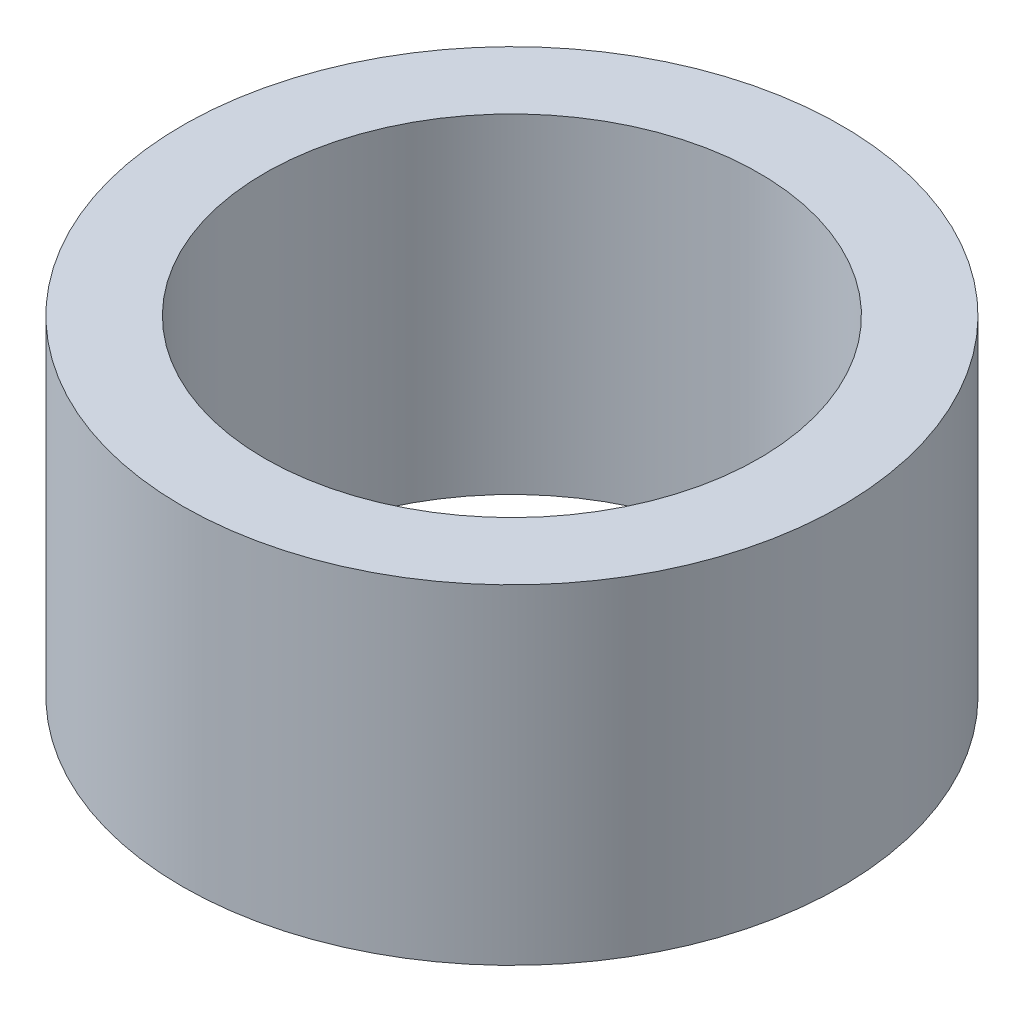
ISO-10303-21;
HEADER;
FILE_DESCRIPTION(('STEP AP214'),'2;1');
FILE_NAME('part.step','',(''),(''),'','','');
FILE_SCHEMA(('AUTOMOTIVE_DESIGN { 1 0 10303 214 1 1 1 1 }'));
ENDSEC;
DATA;
#1=APPLICATION_CONTEXT('core data for automotive mechanical design processes');
#2=APPLICATION_PROTOCOL_DEFINITION('international standard','automotive_design',2000,#1);
#3=PRODUCT_CONTEXT('',#1,'mechanical');
#4=PRODUCT('Part','Part','',(#3));
#5=PRODUCT_RELATED_PRODUCT_CATEGORY('part','',(#4));
#6=PRODUCT_DEFINITION_FORMATION('','',#4);
#7=PRODUCT_DEFINITION_CONTEXT('part definition',#1,'design');
#8=PRODUCT_DEFINITION('design','',#6,#7);
#9=PRODUCT_DEFINITION_SHAPE('','',#8);
#10=(LENGTH_UNIT() NAMED_UNIT(*) SI_UNIT(.MILLI.,.METRE.));
#11=(NAMED_UNIT(*) PLANE_ANGLE_UNIT() SI_UNIT($,.RADIAN.));
#12=(NAMED_UNIT(*) SI_UNIT($,.STERADIAN.) SOLID_ANGLE_UNIT());
#13=UNCERTAINTY_MEASURE_WITH_UNIT(LENGTH_MEASURE(1.E-05),#10,'distance_accuracy_value','');
#14=(GEOMETRIC_REPRESENTATION_CONTEXT(3) GLOBAL_UNCERTAINTY_ASSIGNED_CONTEXT((#13)) GLOBAL_UNIT_ASSIGNED_CONTEXT((#10,
#11,#12)) REPRESENTATION_CONTEXT('',''));
#15=CARTESIAN_POINT('',(0.,0.,0.));
#16=DIRECTION('',(0.,0.,1.));
#17=DIRECTION('',(1.,0.,0.));
#18=AXIS2_PLACEMENT_3D('',#15,#16,#17);
#19=CARTESIAN_POINT('',(0.,4.,0.));
#20=DIRECTION('',(0.,-1.,0.));
#21=DIRECTION('',(0.,0.,-1.));
#22=AXIS2_PLACEMENT_3D('',#19,#20,#21);
#23=CYLINDRICAL_SURFACE('',#22,3.);
#24=CARTESIAN_POINT('',(0.,4.,0.));
#25=DIRECTION('',(0.,1.,0.));
#26=DIRECTION('',(0.,0.,1.));
#27=AXIS2_PLACEMENT_3D('',#24,#25,#26);
#28=CIRCLE('',#27,3.);
#29=CARTESIAN_POINT('',(0.,4.,3.));
#30=VERTEX_POINT('',#29);
#31=EDGE_CURVE('E40',#30,#30,#28,.T.);
#32=ORIENTED_EDGE('',*,*,#31,.T.);
#33=EDGE_LOOP('',(#32));
#34=FACE_BOUND('',#33,.T.);
#35=CARTESIAN_POINT('',(0.,0.,0.));
#36=DIRECTION('',(0.,1.,0.));
#37=DIRECTION('',(0.,0.,1.));
#38=AXIS2_PLACEMENT_3D('',#35,#36,#37);
#39=CIRCLE('',#38,3.);
#40=CARTESIAN_POINT('',(0.,0.,3.));
#41=VERTEX_POINT('',#40);
#42=EDGE_CURVE('E46',#41,#41,#39,.T.);
#43=ORIENTED_EDGE('',*,*,#42,.F.);
#44=EDGE_LOOP('',(#43));
#45=FACE_BOUND('',#44,.T.);
#46=ADVANCED_FACE('F33',(#34,#45),#23,.F.);
#47=CARTESIAN_POINT('',(0.,4.,0.));
#48=DIRECTION('',(0.,-1.,0.));
#49=DIRECTION('',(0.,0.,-1.));
#50=AXIS2_PLACEMENT_3D('',#47,#48,#49);
#51=CYLINDRICAL_SURFACE('',#50,4.);
#52=CARTESIAN_POINT('',(0.,4.,0.));
#53=DIRECTION('',(0.,1.,0.));
#54=DIRECTION('',(0.,0.,1.));
#55=AXIS2_PLACEMENT_3D('',#52,#53,#54);
#56=CIRCLE('',#55,4.);
#57=CARTESIAN_POINT('',(0.,4.,4.));
#58=VERTEX_POINT('',#57);
#59=EDGE_CURVE('E10',#58,#58,#56,.T.);
#60=ORIENTED_EDGE('',*,*,#59,.F.);
#61=EDGE_LOOP('',(#60));
#62=FACE_BOUND('',#61,.T.);
#63=CARTESIAN_POINT('',(0.,0.,0.));
#64=DIRECTION('',(0.,1.,0.));
#65=DIRECTION('',(0.,0.,1.));
#66=AXIS2_PLACEMENT_3D('',#63,#64,#65);
#67=CIRCLE('',#66,4.);
#68=CARTESIAN_POINT('',(0.,0.,4.));
#69=VERTEX_POINT('',#68);
#70=EDGE_CURVE('E36',#69,#69,#67,.T.);
#71=ORIENTED_EDGE('',*,*,#70,.T.);
#72=EDGE_LOOP('',(#71));
#73=FACE_BOUND('',#72,.T.);
#74=ADVANCED_FACE('F53',(#62,#73),#51,.T.);
#75=CARTESIAN_POINT('',(0.,4.,0.));
#76=DIRECTION('',(0.,1.,0.));
#77=DIRECTION('',(0.,0.,1.));
#78=AXIS2_PLACEMENT_3D('',#75,#76,#77);
#79=PLANE('',#78);
#80=ORIENTED_EDGE('',*,*,#31,.F.);
#81=EDGE_LOOP('',(#80));
#82=FACE_BOUND('',#81,.T.);
#83=ORIENTED_EDGE('',*,*,#59,.T.);
#84=EDGE_LOOP('',(#83));
#85=FACE_BOUND('',#84,.T.);
#86=ADVANCED_FACE('F57',(#82,#85),#79,.T.);
#87=CARTESIAN_POINT('',(0.,0.,0.));
#88=DIRECTION('',(0.,1.,0.));
#89=DIRECTION('',(0.,0.,1.));
#90=AXIS2_PLACEMENT_3D('',#87,#88,#89);
#91=PLANE('',#90);
#92=ORIENTED_EDGE('',*,*,#42,.T.);
#93=EDGE_LOOP('',(#92));
#94=FACE_BOUND('',#93,.T.);
#95=ORIENTED_EDGE('',*,*,#70,.F.);
#96=EDGE_LOOP('',(#95));
#97=FACE_BOUND('',#96,.T.);
#98=ADVANCED_FACE('F55',(#94,#97),#91,.F.);
#99=CLOSED_SHELL('',(#46,#74,#86,#98));
#100=MANIFOLD_SOLID_BREP('B2',#99);
#101=ADVANCED_BREP_SHAPE_REPRESENTATION('',(#18,#100),#14);
#102=SHAPE_DEFINITION_REPRESENTATION(#9,#101);
ENDSEC;
END-ISO-10303-21;
